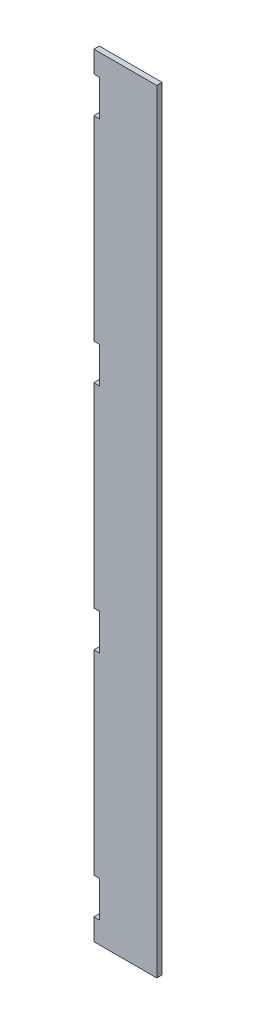
ISO-10303-21;
HEADER;
FILE_DESCRIPTION(('STEP AP214'),'2;1');
FILE_NAME('part.step','',(''),(''),'','','');
FILE_SCHEMA(('AUTOMOTIVE_DESIGN { 1 0 10303 214 1 1 1 1 }'));
ENDSEC;
DATA;
#1=APPLICATION_CONTEXT('core data for automotive mechanical design processes');
#2=APPLICATION_PROTOCOL_DEFINITION('international standard','automotive_design',2000,#1);
#3=PRODUCT_CONTEXT('',#1,'mechanical');
#4=PRODUCT('Part','Part','',(#3));
#5=PRODUCT_RELATED_PRODUCT_CATEGORY('part','',(#4));
#6=PRODUCT_DEFINITION_FORMATION('','',#4);
#7=PRODUCT_DEFINITION_CONTEXT('part definition',#1,'design');
#8=PRODUCT_DEFINITION('design','',#6,#7);
#9=PRODUCT_DEFINITION_SHAPE('','',#8);
#10=(LENGTH_UNIT() NAMED_UNIT(*) SI_UNIT(.MILLI.,.METRE.));
#11=(NAMED_UNIT(*) PLANE_ANGLE_UNIT() SI_UNIT($,.RADIAN.));
#12=(NAMED_UNIT(*) SI_UNIT($,.STERADIAN.) SOLID_ANGLE_UNIT());
#13=UNCERTAINTY_MEASURE_WITH_UNIT(LENGTH_MEASURE(1.E-05),#10,'distance_accuracy_value','');
#14=(GEOMETRIC_REPRESENTATION_CONTEXT(3) GLOBAL_UNCERTAINTY_ASSIGNED_CONTEXT((#13)) GLOBAL_UNIT_ASSIGNED_CONTEXT((#10,
#11,#12)) REPRESENTATION_CONTEXT('',''));
#15=CARTESIAN_POINT('',(0.,0.,0.));
#16=DIRECTION('',(0.,0.,1.));
#17=DIRECTION('',(1.,0.,0.));
#18=AXIS2_PLACEMENT_3D('',#15,#16,#17);
#19=CARTESIAN_POINT('',(0.,429.8,6.));
#20=DIRECTION('',(1.,0.,0.));
#21=DIRECTION('',(0.,0.,-1.));
#22=AXIS2_PLACEMENT_3D('',#19,#20,#21);
#23=PLANE('',#22);
#24=DIRECTION('',(0.,-1.,0.));
#25=VECTOR('',#24,1.);
#26=CARTESIAN_POINT('',(0.,429.8,6.));
#27=LINE('',#26,#25);
#28=CARTESIAN_POINT('',(0.,-405.875,6.00000000000001));
#29=VERTEX_POINT('',#28);
#30=CARTESIAN_POINT('',(0.,-429.8,6.));
#31=VERTEX_POINT('',#30);
#32=EDGE_CURVE('E214',#29,#31,#27,.T.);
#33=ORIENTED_EDGE('',*,*,#32,.F.);
#34=DIRECTION('',(0.,0.,-1.));
#35=VECTOR('',#34,1.);
#36=CARTESIAN_POINT('',(0.,-405.875,6.));
#37=LINE('',#36,#35);
#38=CARTESIAN_POINT('',(0.,-405.875,0.));
#39=VERTEX_POINT('',#38);
#40=EDGE_CURVE('E328',#29,#39,#37,.T.);
#41=ORIENTED_EDGE('',*,*,#40,.T.);
#42=DIRECTION('',(0.,-1.,0.));
#43=VECTOR('',#42,1.);
#44=CARTESIAN_POINT('',(0.,429.8,0.));
#45=LINE('',#44,#43);
#46=CARTESIAN_POINT('',(0.,-429.8,0.));
#47=VERTEX_POINT('',#46);
#48=EDGE_CURVE('E387',#39,#47,#45,.T.);
#49=ORIENTED_EDGE('',*,*,#48,.T.);
#50=DIRECTION('',(0.,0.,-1.));
#51=VECTOR('',#50,1.);
#52=CARTESIAN_POINT('',(0.,-429.8,6.));
#53=LINE('',#52,#51);
#54=EDGE_CURVE('E251',#31,#47,#53,.T.);
#55=ORIENTED_EDGE('',*,*,#54,.F.);
#56=EDGE_LOOP('',(#33,#41,#49,#55));
#57=FACE_BOUND('',#56,.T.);
#58=ADVANCED_FACE('F45',(#57),#23,.F.);
#59=CARTESIAN_POINT('',(0.,-148.675,0.));
#60=VERTEX_POINT('',#59);
#61=CARTESIAN_POINT('',(0.,-365.725,0.));
#62=VERTEX_POINT('',#61);
#63=EDGE_CURVE('E391',#60,#62,#45,.T.);
#64=ORIENTED_EDGE('',*,*,#63,.T.);
#65=DIRECTION('',(0.,0.,1.));
#66=VECTOR('',#65,1.);
#67=CARTESIAN_POINT('',(0.,-365.725,6.));
#68=LINE('',#67,#66);
#69=CARTESIAN_POINT('',(0.,-365.725,6.00000000000001));
#70=VERTEX_POINT('',#69);
#71=EDGE_CURVE('E383',#62,#70,#68,.T.);
#72=ORIENTED_EDGE('',*,*,#71,.T.);
#73=CARTESIAN_POINT('',(0.,-148.675,6.00000000000001));
#74=VERTEX_POINT('',#73);
#75=EDGE_CURVE('E223',#74,#70,#27,.T.);
#76=ORIENTED_EDGE('',*,*,#75,.F.);
#77=DIRECTION('',(0.,0.,-1.));
#78=VECTOR('',#77,1.);
#79=CARTESIAN_POINT('',(0.,-148.675,6.));
#80=LINE('',#79,#78);
#81=EDGE_CURVE('E379',#74,#60,#80,.T.);
#82=ORIENTED_EDGE('',*,*,#81,.T.);
#83=EDGE_LOOP('',(#64,#72,#76,#82));
#84=FACE_BOUND('',#83,.T.);
#85=ADVANCED_FACE('F449',(#84),#23,.F.);
#86=CARTESIAN_POINT('',(0.,108.525,0.));
#87=VERTEX_POINT('',#86);
#88=CARTESIAN_POINT('',(0.,-108.525,0.));
#89=VERTEX_POINT('',#88);
#90=EDGE_CURVE('E397',#87,#89,#45,.T.);
#91=ORIENTED_EDGE('',*,*,#90,.T.);
#92=DIRECTION('',(0.,0.,1.));
#93=VECTOR('',#92,1.);
#94=CARTESIAN_POINT('',(0.,-108.525,6.));
#95=LINE('',#94,#93);
#96=CARTESIAN_POINT('',(0.,-108.525,6.00000000000001));
#97=VERTEX_POINT('',#96);
#98=EDGE_CURVE('E375',#89,#97,#95,.T.);
#99=ORIENTED_EDGE('',*,*,#98,.T.);
#100=CARTESIAN_POINT('',(0.,108.525,6.00000000000001));
#101=VERTEX_POINT('',#100);
#102=EDGE_CURVE('E220',#101,#97,#27,.T.);
#103=ORIENTED_EDGE('',*,*,#102,.F.);
#104=DIRECTION('',(0.,0.,-1.));
#105=VECTOR('',#104,1.);
#106=CARTESIAN_POINT('',(0.,108.525,6.));
#107=LINE('',#106,#105);
#108=EDGE_CURVE('E371',#101,#87,#107,.T.);
#109=ORIENTED_EDGE('',*,*,#108,.T.);
#110=EDGE_LOOP('',(#91,#99,#103,#109));
#111=FACE_BOUND('',#110,.T.);
#112=ADVANCED_FACE('F410',(#111),#23,.F.);
#113=CARTESIAN_POINT('',(0.,365.725,0.));
#114=VERTEX_POINT('',#113);
#115=CARTESIAN_POINT('',(0.,148.675,0.));
#116=VERTEX_POINT('',#115);
#117=EDGE_CURVE('E400',#114,#116,#45,.T.);
#118=ORIENTED_EDGE('',*,*,#117,.T.);
#119=DIRECTION('',(0.,0.,1.));
#120=VECTOR('',#119,1.);
#121=CARTESIAN_POINT('',(0.,148.675,6.));
#122=LINE('',#121,#120);
#123=CARTESIAN_POINT('',(0.,148.675,6.00000000000001));
#124=VERTEX_POINT('',#123);
#125=EDGE_CURVE('E367',#116,#124,#122,.T.);
#126=ORIENTED_EDGE('',*,*,#125,.T.);
#127=CARTESIAN_POINT('',(0.,365.725,6.00000000000001));
#128=VERTEX_POINT('',#127);
#129=EDGE_CURVE('E212',#128,#124,#27,.T.);
#130=ORIENTED_EDGE('',*,*,#129,.F.);
#131=DIRECTION('',(0.,0.,-1.));
#132=VECTOR('',#131,1.);
#133=CARTESIAN_POINT('',(0.,365.725,6.));
#134=LINE('',#133,#132);
#135=EDGE_CURVE('E202',#128,#114,#134,.T.);
#136=ORIENTED_EDGE('',*,*,#135,.T.);
#137=EDGE_LOOP('',(#118,#126,#130,#136));
#138=FACE_BOUND('',#137,.T.);
#139=ADVANCED_FACE('F434',(#138),#23,.F.);
#140=CARTESIAN_POINT('',(0.,429.8,0.));
#141=VERTEX_POINT('',#140);
#142=CARTESIAN_POINT('',(0.,405.875,0.));
#143=VERTEX_POINT('',#142);
#144=EDGE_CURVE('E200',#141,#143,#45,.T.);
#145=ORIENTED_EDGE('',*,*,#144,.T.);
#146=DIRECTION('',(0.,0.,1.));
#147=VECTOR('',#146,1.);
#148=CARTESIAN_POINT('',(0.,405.875,6.));
#149=LINE('',#148,#147);
#150=CARTESIAN_POINT('',(0.,405.875,6.00000000000001));
#151=VERTEX_POINT('',#150);
#152=EDGE_CURVE('E187',#143,#151,#149,.T.);
#153=ORIENTED_EDGE('',*,*,#152,.T.);
#154=CARTESIAN_POINT('',(0.,429.8,6.));
#155=VERTEX_POINT('',#154);
#156=EDGE_CURVE('E198',#155,#151,#27,.T.);
#157=ORIENTED_EDGE('',*,*,#156,.F.);
#158=DIRECTION('',(0.,0.,-1.));
#159=VECTOR('',#158,1.);
#160=CARTESIAN_POINT('',(0.,429.8,6.));
#161=LINE('',#160,#159);
#162=EDGE_CURVE('E241',#155,#141,#161,.T.);
#163=ORIENTED_EDGE('',*,*,#162,.T.);
#164=EDGE_LOOP('',(#145,#153,#157,#163));
#165=FACE_BOUND('',#164,.T.);
#166=ADVANCED_FACE('F47',(#165),#23,.F.);
#167=CARTESIAN_POINT('',(0.,-429.8,6.));
#168=DIRECTION('',(0.,1.,0.));
#169=DIRECTION('',(0.,0.,1.));
#170=AXIS2_PLACEMENT_3D('',#167,#168,#169);
#171=PLANE('',#170);
#172=DIRECTION('',(1.,0.,0.));
#173=VECTOR('',#172,1.);
#174=CARTESIAN_POINT('',(0.,-429.8,0.));
#175=LINE('',#174,#173);
#176=CARTESIAN_POINT('',(70.,-429.8,0.));
#177=VERTEX_POINT('',#176);
#178=EDGE_CURVE('E237',#47,#177,#175,.T.);
#179=ORIENTED_EDGE('',*,*,#178,.T.);
#180=DIRECTION('',(0.,0.,-1.));
#181=VECTOR('',#180,1.);
#182=CARTESIAN_POINT('',(70.,-429.8,6.));
#183=LINE('',#182,#181);
#184=CARTESIAN_POINT('',(70.,-429.8,6.));
#185=VERTEX_POINT('',#184);
#186=EDGE_CURVE('E247',#185,#177,#183,.T.);
#187=ORIENTED_EDGE('',*,*,#186,.F.);
#188=DIRECTION('',(1.,0.,0.));
#189=VECTOR('',#188,1.);
#190=CARTESIAN_POINT('',(0.,-429.8,6.));
#191=LINE('',#190,#189);
#192=EDGE_CURVE('E211',#31,#185,#191,.T.);
#193=ORIENTED_EDGE('',*,*,#192,.F.);
#194=ORIENTED_EDGE('',*,*,#54,.T.);
#195=EDGE_LOOP('',(#179,#187,#193,#194));
#196=FACE_BOUND('',#195,.T.);
#197=ADVANCED_FACE('F456',(#196),#171,.F.);
#198=CARTESIAN_POINT('',(70.,-429.8,6.));
#199=DIRECTION('',(-1.,0.,0.));
#200=DIRECTION('',(0.,0.,1.));
#201=AXIS2_PLACEMENT_3D('',#198,#199,#200);
#202=PLANE('',#201);
#203=DIRECTION('',(0.,1.,0.));
#204=VECTOR('',#203,1.);
#205=CARTESIAN_POINT('',(70.,-429.8,0.));
#206=LINE('',#205,#204);
#207=CARTESIAN_POINT('',(70.,429.8,0.));
#208=VERTEX_POINT('',#207);
#209=EDGE_CURVE('E231',#177,#208,#206,.T.);
#210=ORIENTED_EDGE('',*,*,#209,.T.);
#211=DIRECTION('',(0.,0.,-1.));
#212=VECTOR('',#211,1.);
#213=CARTESIAN_POINT('',(70.,429.8,6.));
#214=LINE('',#213,#212);
#215=CARTESIAN_POINT('',(70.,429.8,6.));
#216=VERTEX_POINT('',#215);
#217=EDGE_CURVE('E244',#216,#208,#214,.T.);
#218=ORIENTED_EDGE('',*,*,#217,.F.);
#219=DIRECTION('',(0.,1.,0.));
#220=VECTOR('',#219,1.);
#221=CARTESIAN_POINT('',(70.,-429.8,6.));
#222=LINE('',#221,#220);
#223=EDGE_CURVE('E217',#185,#216,#222,.T.);
#224=ORIENTED_EDGE('',*,*,#223,.F.);
#225=ORIENTED_EDGE('',*,*,#186,.T.);
#226=EDGE_LOOP('',(#210,#218,#224,#225));
#227=FACE_BOUND('',#226,.T.);
#228=ADVANCED_FACE('F462',(#227),#202,.F.);
#229=CARTESIAN_POINT('',(70.,429.8,6.));
#230=DIRECTION('',(0.,-1.,0.));
#231=DIRECTION('',(0.,0.,-1.));
#232=AXIS2_PLACEMENT_3D('',#229,#230,#231);
#233=PLANE('',#232);
#234=DIRECTION('',(-1.,0.,0.));
#235=VECTOR('',#234,1.);
#236=CARTESIAN_POINT('',(70.,429.8,0.));
#237=LINE('',#236,#235);
#238=EDGE_CURVE('E224',#208,#141,#237,.T.);
#239=ORIENTED_EDGE('',*,*,#238,.T.);
#240=ORIENTED_EDGE('',*,*,#162,.F.);
#241=DIRECTION('',(-1.,0.,0.));
#242=VECTOR('',#241,1.);
#243=CARTESIAN_POINT('',(70.,429.8,6.));
#244=LINE('',#243,#242);
#245=EDGE_CURVE('E208',#216,#155,#244,.T.);
#246=ORIENTED_EDGE('',*,*,#245,.F.);
#247=ORIENTED_EDGE('',*,*,#217,.T.);
#248=EDGE_LOOP('',(#239,#240,#246,#247));
#249=FACE_BOUND('',#248,.T.);
#250=ADVANCED_FACE('F622',(#249),#233,.F.);
#251=CARTESIAN_POINT('',(0.,0.,6.));
#252=DIRECTION('',(0.,0.,1.));
#253=DIRECTION('',(1.,0.,0.));
#254=AXIS2_PLACEMENT_3D('',#251,#252,#253);
#255=PLANE('',#254);
#256=DIRECTION('',(1.,0.,0.));
#257=VECTOR('',#256,1.);
#258=CARTESIAN_POINT('',(-12.075,-365.725,6.00000000000001));
#259=LINE('',#258,#257);
#260=CARTESIAN_POINT('',(6.07500000000001,-365.725,6.));
#261=VERTEX_POINT('',#260);
#262=EDGE_CURVE('E203',#70,#261,#259,.T.);
#263=ORIENTED_EDGE('',*,*,#262,.T.);
#264=DIRECTION('',(0.,-1.,0.));
#265=VECTOR('',#264,1.);
#266=CARTESIAN_POINT('',(6.07500000000001,-365.725,6.00000000000001));
#267=LINE('',#266,#265);
#268=CARTESIAN_POINT('',(6.07500000000001,-405.875,6.));
#269=VERTEX_POINT('',#268);
#270=EDGE_CURVE('E323',#261,#269,#267,.T.);
#271=ORIENTED_EDGE('',*,*,#270,.T.);
#272=DIRECTION('',(-1.,0.,0.));
#273=VECTOR('',#272,1.);
#274=CARTESIAN_POINT('',(6.07500000000001,-405.875,6.00000000000001));
#275=LINE('',#274,#273);
#276=EDGE_CURVE('E327',#269,#29,#275,.T.);
#277=ORIENTED_EDGE('',*,*,#276,.T.);
#278=ORIENTED_EDGE('',*,*,#32,.T.);
#279=ORIENTED_EDGE('',*,*,#192,.T.);
#280=ORIENTED_EDGE('',*,*,#223,.T.);
#281=ORIENTED_EDGE('',*,*,#245,.T.);
#282=ORIENTED_EDGE('',*,*,#156,.T.);
#283=DIRECTION('',(1.,0.,0.));
#284=VECTOR('',#283,1.);
#285=CARTESIAN_POINT('',(-12.075,405.875,6.00000000000001));
#286=LINE('',#285,#284);
#287=CARTESIAN_POINT('',(6.07500000000001,405.875,6.));
#288=VERTEX_POINT('',#287);
#289=EDGE_CURVE('E184',#151,#288,#286,.T.);
#290=ORIENTED_EDGE('',*,*,#289,.T.);
#291=DIRECTION('',(0.,-1.,0.));
#292=VECTOR('',#291,1.);
#293=CARTESIAN_POINT('',(6.07500000000001,405.875,6.00000000000001));
#294=LINE('',#293,#292);
#295=CARTESIAN_POINT('',(6.07500000000001,365.725,6.));
#296=VERTEX_POINT('',#295);
#297=EDGE_CURVE('E61',#288,#296,#294,.T.);
#298=ORIENTED_EDGE('',*,*,#297,.T.);
#299=DIRECTION('',(-1.,0.,0.));
#300=VECTOR('',#299,1.);
#301=CARTESIAN_POINT('',(6.07500000000001,365.725,6.00000000000001));
#302=LINE('',#301,#300);
#303=EDGE_CURVE('E192',#296,#128,#302,.T.);
#304=ORIENTED_EDGE('',*,*,#303,.T.);
#305=ORIENTED_EDGE('',*,*,#129,.T.);
#306=DIRECTION('',(1.,0.,0.));
#307=VECTOR('',#306,1.);
#308=CARTESIAN_POINT('',(-12.075,148.675,6.00000000000001));
#309=LINE('',#308,#307);
#310=CARTESIAN_POINT('',(6.07500000000001,148.675,6.));
#311=VERTEX_POINT('',#310);
#312=EDGE_CURVE('E344',#124,#311,#309,.T.);
#313=ORIENTED_EDGE('',*,*,#312,.T.);
#314=DIRECTION('',(0.,-1.,0.));
#315=VECTOR('',#314,1.);
#316=CARTESIAN_POINT('',(6.07500000000001,148.675,6.00000000000001));
#317=LINE('',#316,#315);
#318=CARTESIAN_POINT('',(6.07500000000001,108.525,6.));
#319=VERTEX_POINT('',#318);
#320=EDGE_CURVE('E191',#311,#319,#317,.T.);
#321=ORIENTED_EDGE('',*,*,#320,.T.);
#322=DIRECTION('',(-1.,0.,0.));
#323=VECTOR('',#322,1.);
#324=CARTESIAN_POINT('',(6.07500000000001,108.525,6.00000000000001));
#325=LINE('',#324,#323);
#326=EDGE_CURVE('E352',#319,#101,#325,.T.);
#327=ORIENTED_EDGE('',*,*,#326,.T.);
#328=ORIENTED_EDGE('',*,*,#102,.T.);
#329=DIRECTION('',(1.,0.,0.));
#330=VECTOR('',#329,1.);
#331=CARTESIAN_POINT('',(-12.075,-108.525,6.00000000000001));
#332=LINE('',#331,#330);
#333=CARTESIAN_POINT('',(6.07500000000001,-108.525,6.));
#334=VERTEX_POINT('',#333);
#335=EDGE_CURVE('E332',#97,#334,#332,.T.);
#336=ORIENTED_EDGE('',*,*,#335,.T.);
#337=DIRECTION('',(0.,-1.,0.));
#338=VECTOR('',#337,1.);
#339=CARTESIAN_POINT('',(6.07500000000001,-108.525,6.00000000000001));
#340=LINE('',#339,#338);
#341=CARTESIAN_POINT('',(6.07500000000001,-148.675,6.));
#342=VERTEX_POINT('',#341);
#343=EDGE_CURVE('E341',#334,#342,#340,.T.);
#344=ORIENTED_EDGE('',*,*,#343,.T.);
#345=DIRECTION('',(-1.,0.,0.));
#346=VECTOR('',#345,1.);
#347=CARTESIAN_POINT('',(6.07500000000001,-148.675,6.00000000000001));
#348=LINE('',#347,#346);
#349=EDGE_CURVE('E336',#342,#74,#348,.T.);
#350=ORIENTED_EDGE('',*,*,#349,.T.);
#351=ORIENTED_EDGE('',*,*,#75,.T.);
#352=EDGE_LOOP('',(#263,#271,#277,#278,#279,#280,#281,#282,#290,#298,#304,#305,#313,#321,#327,
#328,#336,#344,#350,#351));
#353=FACE_BOUND('',#352,.T.);
#354=ADVANCED_FACE('F206',(#353),#255,.T.);
#355=CARTESIAN_POINT('',(0.,0.,0.));
#356=DIRECTION('',(0.,0.,1.));
#357=DIRECTION('',(1.,0.,0.));
#358=AXIS2_PLACEMENT_3D('',#355,#356,#357);
#359=PLANE('',#358);
#360=DIRECTION('',(0.,1.,0.));
#361=VECTOR('',#360,1.);
#362=CARTESIAN_POINT('',(6.07500000000001,0.,0.));
#363=LINE('',#362,#361);
#364=CARTESIAN_POINT('',(6.07500000000001,-405.875,0.));
#365=VERTEX_POINT('',#364);
#366=CARTESIAN_POINT('',(6.07500000000001,-365.725,0.));
#367=VERTEX_POINT('',#366);
#368=EDGE_CURVE('E286',#365,#367,#363,.T.);
#369=ORIENTED_EDGE('',*,*,#368,.T.);
#370=DIRECTION('',(-1.,0.,0.));
#371=VECTOR('',#370,1.);
#372=CARTESIAN_POINT('',(0.,-365.725,0.));
#373=LINE('',#372,#371);
#374=EDGE_CURVE('E289',#367,#62,#373,.T.);
#375=ORIENTED_EDGE('',*,*,#374,.T.);
#376=ORIENTED_EDGE('',*,*,#63,.F.);
#377=DIRECTION('',(1.,0.,0.));
#378=VECTOR('',#377,1.);
#379=CARTESIAN_POINT('',(0.,-148.675,0.));
#380=LINE('',#379,#378);
#381=CARTESIAN_POINT('',(6.07500000000001,-148.675,0.));
#382=VERTEX_POINT('',#381);
#383=EDGE_CURVE('E273',#60,#382,#380,.T.);
#384=ORIENTED_EDGE('',*,*,#383,.T.);
#385=DIRECTION('',(0.,1.,0.));
#386=VECTOR('',#385,1.);
#387=CARTESIAN_POINT('',(6.07500000000001,0.,0.));
#388=LINE('',#387,#386);
#389=CARTESIAN_POINT('',(6.07500000000001,-108.525,0.));
#390=VERTEX_POINT('',#389);
#391=EDGE_CURVE('E276',#382,#390,#388,.T.);
#392=ORIENTED_EDGE('',*,*,#391,.T.);
#393=DIRECTION('',(-1.,0.,0.));
#394=VECTOR('',#393,1.);
#395=CARTESIAN_POINT('',(0.,-108.525,0.));
#396=LINE('',#395,#394);
#397=EDGE_CURVE('E279',#390,#89,#396,.T.);
#398=ORIENTED_EDGE('',*,*,#397,.T.);
#399=ORIENTED_EDGE('',*,*,#90,.F.);
#400=DIRECTION('',(1.,0.,0.));
#401=VECTOR('',#400,1.);
#402=CARTESIAN_POINT('',(0.,108.525,0.));
#403=LINE('',#402,#401);
#404=CARTESIAN_POINT('',(6.07500000000001,108.525,0.));
#405=VERTEX_POINT('',#404);
#406=EDGE_CURVE('E263',#87,#405,#403,.T.);
#407=ORIENTED_EDGE('',*,*,#406,.T.);
#408=DIRECTION('',(0.,1.,0.));
#409=VECTOR('',#408,1.);
#410=CARTESIAN_POINT('',(6.07500000000001,0.,0.));
#411=LINE('',#410,#409);
#412=CARTESIAN_POINT('',(6.07500000000001,148.675,0.));
#413=VERTEX_POINT('',#412);
#414=EDGE_CURVE('E266',#405,#413,#411,.T.);
#415=ORIENTED_EDGE('',*,*,#414,.T.);
#416=DIRECTION('',(-1.,0.,0.));
#417=VECTOR('',#416,1.);
#418=CARTESIAN_POINT('',(0.,148.675,0.));
#419=LINE('',#418,#417);
#420=EDGE_CURVE('E269',#413,#116,#419,.T.);
#421=ORIENTED_EDGE('',*,*,#420,.T.);
#422=ORIENTED_EDGE('',*,*,#117,.F.);
#423=DIRECTION('',(1.,0.,0.));
#424=VECTOR('',#423,1.);
#425=CARTESIAN_POINT('',(0.,365.725,0.));
#426=LINE('',#425,#424);
#427=CARTESIAN_POINT('',(6.07500000000001,365.725,0.));
#428=VERTEX_POINT('',#427);
#429=EDGE_CURVE('E255',#114,#428,#426,.T.);
#430=ORIENTED_EDGE('',*,*,#429,.T.);
#431=DIRECTION('',(0.,1.,0.));
#432=VECTOR('',#431,1.);
#433=CARTESIAN_POINT('',(6.07500000000001,0.,0.));
#434=LINE('',#433,#432);
#435=CARTESIAN_POINT('',(6.07500000000001,405.875,0.));
#436=VERTEX_POINT('',#435);
#437=EDGE_CURVE('E69',#428,#436,#434,.T.);
#438=ORIENTED_EDGE('',*,*,#437,.T.);
#439=DIRECTION('',(-1.,0.,0.));
#440=VECTOR('',#439,1.);
#441=CARTESIAN_POINT('',(0.,405.875,0.));
#442=LINE('',#441,#440);
#443=EDGE_CURVE('E260',#436,#143,#442,.T.);
#444=ORIENTED_EDGE('',*,*,#443,.T.);
#445=ORIENTED_EDGE('',*,*,#144,.F.);
#446=ORIENTED_EDGE('',*,*,#238,.F.);
#447=ORIENTED_EDGE('',*,*,#209,.F.);
#448=ORIENTED_EDGE('',*,*,#178,.F.);
#449=ORIENTED_EDGE('',*,*,#48,.F.);
#450=DIRECTION('',(1.,0.,0.));
#451=VECTOR('',#450,1.);
#452=CARTESIAN_POINT('',(0.,-405.875,0.));
#453=LINE('',#452,#451);
#454=EDGE_CURVE('E283',#39,#365,#453,.T.);
#455=ORIENTED_EDGE('',*,*,#454,.T.);
#456=EDGE_LOOP('',(#369,#375,#376,#384,#392,#398,#399,#407,#415,#421,#422,#430,#438,#444,#445,
#446,#447,#448,#449,#455));
#457=FACE_BOUND('',#456,.T.);
#458=ADVANCED_FACE('F413',(#457),#359,.F.);
#459=CARTESIAN_POINT('',(6.07500000000001,405.875,30.0000000000067));
#460=DIRECTION('',(1.,0.,0.));
#461=DIRECTION('',(0.,0.,-1.));
#462=AXIS2_PLACEMENT_3D('',#459,#460,#461);
#463=PLANE('',#462);
#464=ORIENTED_EDGE('',*,*,#437,.F.);
#465=DIRECTION('',(0.,0.,1.));
#466=VECTOR('',#465,1.);
#467=CARTESIAN_POINT('',(6.07500000000001,365.725,30.0000000000067));
#468=LINE('',#467,#466);
#469=EDGE_CURVE('E293',#428,#296,#468,.T.);
#470=ORIENTED_EDGE('',*,*,#469,.T.);
#471=ORIENTED_EDGE('',*,*,#297,.F.);
#472=DIRECTION('',(0.,0.,1.));
#473=VECTOR('',#472,1.);
#474=CARTESIAN_POINT('',(6.07500000000001,405.875,30.0000000000067));
#475=LINE('',#474,#473);
#476=EDGE_CURVE('E11',#436,#288,#475,.T.);
#477=ORIENTED_EDGE('',*,*,#476,.F.);
#478=EDGE_LOOP('',(#464,#470,#471,#477));
#479=FACE_BOUND('',#478,.T.);
#480=ADVANCED_FACE('F438',(#479),#463,.F.);
#481=CARTESIAN_POINT('',(6.07500000000001,365.725,30.0000000000067));
#482=DIRECTION('',(0.,-1.,0.));
#483=DIRECTION('',(-1.,0.,0.));
#484=AXIS2_PLACEMENT_3D('',#481,#482,#483);
#485=PLANE('',#484);
#486=ORIENTED_EDGE('',*,*,#303,.F.);
#487=ORIENTED_EDGE('',*,*,#469,.F.);
#488=ORIENTED_EDGE('',*,*,#429,.F.);
#489=ORIENTED_EDGE('',*,*,#135,.F.);
#490=EDGE_LOOP('',(#486,#487,#488,#489));
#491=FACE_BOUND('',#490,.T.);
#492=ADVANCED_FACE('F437',(#491),#485,.F.);
#493=CARTESIAN_POINT('',(-12.075,405.875,30.0000000000067));
#494=DIRECTION('',(0.,1.,0.));
#495=DIRECTION('',(1.,0.,0.));
#496=AXIS2_PLACEMENT_3D('',#493,#494,#495);
#497=PLANE('',#496);
#498=ORIENTED_EDGE('',*,*,#443,.F.);
#499=ORIENTED_EDGE('',*,*,#476,.T.);
#500=ORIENTED_EDGE('',*,*,#289,.F.);
#501=ORIENTED_EDGE('',*,*,#152,.F.);
#502=EDGE_LOOP('',(#498,#499,#500,#501));
#503=FACE_BOUND('',#502,.T.);
#504=ADVANCED_FACE('F186',(#503),#497,.F.);
#505=CARTESIAN_POINT('',(6.07500000000001,148.675,30.0000000000067));
#506=DIRECTION('',(1.,0.,0.));
#507=DIRECTION('',(0.,0.,-1.));
#508=AXIS2_PLACEMENT_3D('',#505,#506,#507);
#509=PLANE('',#508);
#510=ORIENTED_EDGE('',*,*,#414,.F.);
#511=DIRECTION('',(0.,0.,1.));
#512=VECTOR('',#511,1.);
#513=CARTESIAN_POINT('',(6.07500000000001,108.525,30.0000000000067));
#514=LINE('',#513,#512);
#515=EDGE_CURVE('E300',#405,#319,#514,.T.);
#516=ORIENTED_EDGE('',*,*,#515,.T.);
#517=ORIENTED_EDGE('',*,*,#320,.F.);
#518=DIRECTION('',(0.,0.,1.));
#519=VECTOR('',#518,1.);
#520=CARTESIAN_POINT('',(6.07500000000001,148.675,30.0000000000067));
#521=LINE('',#520,#519);
#522=EDGE_CURVE('E296',#413,#311,#521,.T.);
#523=ORIENTED_EDGE('',*,*,#522,.F.);
#524=EDGE_LOOP('',(#510,#516,#517,#523));
#525=FACE_BOUND('',#524,.T.);
#526=ADVANCED_FACE('F428',(#525),#509,.F.);
#527=CARTESIAN_POINT('',(6.07500000000001,108.525,30.0000000000067));
#528=DIRECTION('',(0.,-1.,0.));
#529=DIRECTION('',(-1.,0.,0.));
#530=AXIS2_PLACEMENT_3D('',#527,#528,#529);
#531=PLANE('',#530);
#532=ORIENTED_EDGE('',*,*,#326,.F.);
#533=ORIENTED_EDGE('',*,*,#515,.F.);
#534=ORIENTED_EDGE('',*,*,#406,.F.);
#535=ORIENTED_EDGE('',*,*,#108,.F.);
#536=EDGE_LOOP('',(#532,#533,#534,#535));
#537=FACE_BOUND('',#536,.T.);
#538=ADVANCED_FACE('F426',(#537),#531,.F.);
#539=CARTESIAN_POINT('',(-12.075,148.675,30.0000000000067));
#540=DIRECTION('',(0.,1.,0.));
#541=DIRECTION('',(1.,0.,0.));
#542=AXIS2_PLACEMENT_3D('',#539,#540,#541);
#543=PLANE('',#542);
#544=ORIENTED_EDGE('',*,*,#420,.F.);
#545=ORIENTED_EDGE('',*,*,#522,.T.);
#546=ORIENTED_EDGE('',*,*,#312,.F.);
#547=ORIENTED_EDGE('',*,*,#125,.F.);
#548=EDGE_LOOP('',(#544,#545,#546,#547));
#549=FACE_BOUND('',#548,.T.);
#550=ADVANCED_FACE('F432',(#549),#543,.F.);
#551=CARTESIAN_POINT('',(6.07500000000001,-108.525,30.0000000000067));
#552=DIRECTION('',(1.,0.,0.));
#553=DIRECTION('',(0.,0.,-1.));
#554=AXIS2_PLACEMENT_3D('',#551,#552,#553);
#555=PLANE('',#554);
#556=ORIENTED_EDGE('',*,*,#391,.F.);
#557=DIRECTION('',(0.,0.,1.));
#558=VECTOR('',#557,1.);
#559=CARTESIAN_POINT('',(6.07500000000001,-148.675,30.0000000000067));
#560=LINE('',#559,#558);
#561=EDGE_CURVE('E308',#382,#342,#560,.T.);
#562=ORIENTED_EDGE('',*,*,#561,.T.);
#563=ORIENTED_EDGE('',*,*,#343,.F.);
#564=DIRECTION('',(0.,0.,1.));
#565=VECTOR('',#564,1.);
#566=CARTESIAN_POINT('',(6.07500000000001,-108.525,30.0000000000067));
#567=LINE('',#566,#565);
#568=EDGE_CURVE('E304',#390,#334,#567,.T.);
#569=ORIENTED_EDGE('',*,*,#568,.F.);
#570=EDGE_LOOP('',(#556,#562,#563,#569));
#571=FACE_BOUND('',#570,.T.);
#572=ADVANCED_FACE('F421',(#571),#555,.F.);
#573=CARTESIAN_POINT('',(6.07500000000001,-148.675,30.0000000000067));
#574=DIRECTION('',(0.,-1.,0.));
#575=DIRECTION('',(-1.,0.,0.));
#576=AXIS2_PLACEMENT_3D('',#573,#574,#575);
#577=PLANE('',#576);
#578=ORIENTED_EDGE('',*,*,#349,.F.);
#579=ORIENTED_EDGE('',*,*,#561,.F.);
#580=ORIENTED_EDGE('',*,*,#383,.F.);
#581=ORIENTED_EDGE('',*,*,#81,.F.);
#582=EDGE_LOOP('',(#578,#579,#580,#581));
#583=FACE_BOUND('',#582,.T.);
#584=ADVANCED_FACE('F532',(#583),#577,.F.);
#585=CARTESIAN_POINT('',(-12.075,-108.525,30.0000000000067));
#586=DIRECTION('',(0.,1.,0.));
#587=DIRECTION('',(1.,0.,0.));
#588=AXIS2_PLACEMENT_3D('',#585,#586,#587);
#589=PLANE('',#588);
#590=ORIENTED_EDGE('',*,*,#397,.F.);
#591=ORIENTED_EDGE('',*,*,#568,.T.);
#592=ORIENTED_EDGE('',*,*,#335,.F.);
#593=ORIENTED_EDGE('',*,*,#98,.F.);
#594=EDGE_LOOP('',(#590,#591,#592,#593));
#595=FACE_BOUND('',#594,.T.);
#596=ADVANCED_FACE('F419',(#595),#589,.F.);
#597=CARTESIAN_POINT('',(6.07500000000001,-365.725,30.0000000000067));
#598=DIRECTION('',(1.,0.,0.));
#599=DIRECTION('',(0.,0.,-1.));
#600=AXIS2_PLACEMENT_3D('',#597,#598,#599);
#601=PLANE('',#600);
#602=ORIENTED_EDGE('',*,*,#368,.F.);
#603=DIRECTION('',(0.,0.,1.));
#604=VECTOR('',#603,1.);
#605=CARTESIAN_POINT('',(6.07500000000001,-405.875,30.0000000000067));
#606=LINE('',#605,#604);
#607=EDGE_CURVE('E54',#365,#269,#606,.T.);
#608=ORIENTED_EDGE('',*,*,#607,.T.);
#609=ORIENTED_EDGE('',*,*,#270,.F.);
#610=DIRECTION('',(0.,0.,1.));
#611=VECTOR('',#610,1.);
#612=CARTESIAN_POINT('',(6.07500000000001,-365.725,30.0000000000067));
#613=LINE('',#612,#611);
#614=EDGE_CURVE('E312',#367,#261,#613,.T.);
#615=ORIENTED_EDGE('',*,*,#614,.F.);
#616=EDGE_LOOP('',(#602,#608,#609,#615));
#617=FACE_BOUND('',#616,.T.);
#618=ADVANCED_FACE('F320',(#617),#601,.F.);
#619=CARTESIAN_POINT('',(6.07500000000001,-405.875,30.0000000000067));
#620=DIRECTION('',(0.,-1.,0.));
#621=DIRECTION('',(-1.,0.,0.));
#622=AXIS2_PLACEMENT_3D('',#619,#620,#621);
#623=PLANE('',#622);
#624=ORIENTED_EDGE('',*,*,#276,.F.);
#625=ORIENTED_EDGE('',*,*,#607,.F.);
#626=ORIENTED_EDGE('',*,*,#454,.F.);
#627=ORIENTED_EDGE('',*,*,#40,.F.);
#628=EDGE_LOOP('',(#624,#625,#626,#627));
#629=FACE_BOUND('',#628,.T.);
#630=ADVANCED_FACE('F325',(#629),#623,.F.);
#631=CARTESIAN_POINT('',(-12.075,-365.725,30.0000000000067));
#632=DIRECTION('',(0.,1.,0.));
#633=DIRECTION('',(1.,0.,0.));
#634=AXIS2_PLACEMENT_3D('',#631,#632,#633);
#635=PLANE('',#634);
#636=ORIENTED_EDGE('',*,*,#374,.F.);
#637=ORIENTED_EDGE('',*,*,#614,.T.);
#638=ORIENTED_EDGE('',*,*,#262,.F.);
#639=ORIENTED_EDGE('',*,*,#71,.F.);
#640=EDGE_LOOP('',(#636,#637,#638,#639));
#641=FACE_BOUND('',#640,.T.);
#642=ADVANCED_FACE('F566',(#641),#635,.F.);
#643=CLOSED_SHELL('',(#58,#85,#112,#139,#166,#197,#228,#250,#354,#458,#480,#492,#504,#526,#538,
#550,#572,#584,#596,#618,#630,#642));
#644=MANIFOLD_SOLID_BREP('B2',#643);
#645=ADVANCED_BREP_SHAPE_REPRESENTATION('',(#18,#644),#14);
#646=SHAPE_DEFINITION_REPRESENTATION(#9,#645);
ENDSEC;
END-ISO-10303-21;
